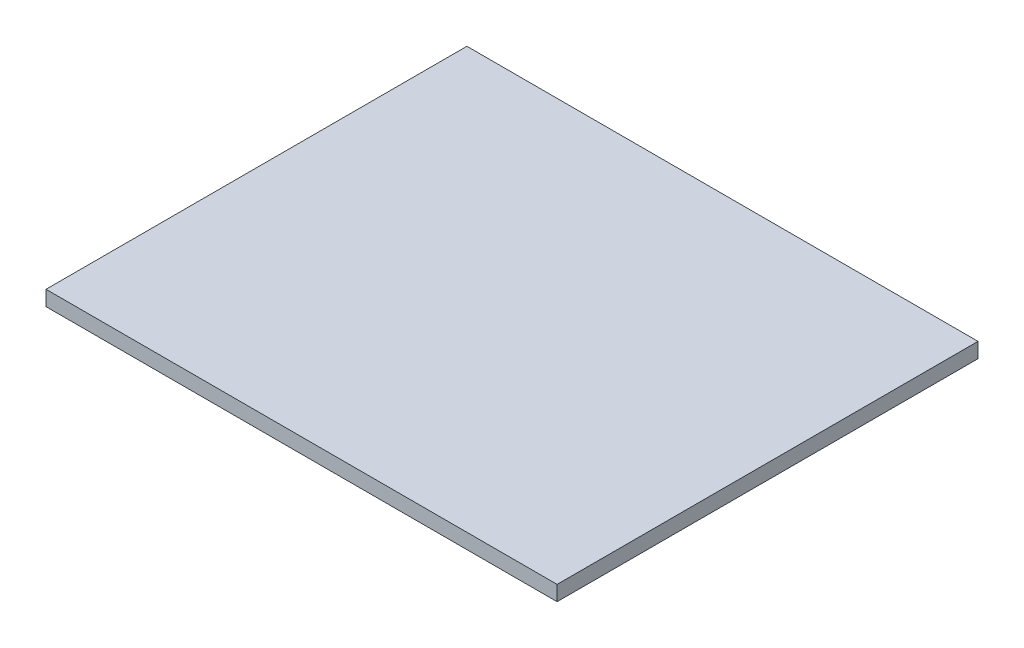
ISO-10303-21;
HEADER;
FILE_DESCRIPTION(('STEP AP214'),'2;1');
FILE_NAME('part.step','',(''),(''),'','','');
FILE_SCHEMA(('AUTOMOTIVE_DESIGN { 1 0 10303 214 1 1 1 1 }'));
ENDSEC;
DATA;
#1=APPLICATION_CONTEXT('core data for automotive mechanical design processes');
#2=APPLICATION_PROTOCOL_DEFINITION('international standard','automotive_design',2000,#1);
#3=PRODUCT_CONTEXT('',#1,'mechanical');
#4=PRODUCT('Part','Part','',(#3));
#5=PRODUCT_RELATED_PRODUCT_CATEGORY('part','',(#4));
#6=PRODUCT_DEFINITION_FORMATION('','',#4);
#7=PRODUCT_DEFINITION_CONTEXT('part definition',#1,'design');
#8=PRODUCT_DEFINITION('design','',#6,#7);
#9=PRODUCT_DEFINITION_SHAPE('','',#8);
#10=(LENGTH_UNIT() NAMED_UNIT(*) SI_UNIT(.MILLI.,.METRE.));
#11=(NAMED_UNIT(*) PLANE_ANGLE_UNIT() SI_UNIT($,.RADIAN.));
#12=(NAMED_UNIT(*) SI_UNIT($,.STERADIAN.) SOLID_ANGLE_UNIT());
#13=UNCERTAINTY_MEASURE_WITH_UNIT(LENGTH_MEASURE(1.E-05),#10,'distance_accuracy_value','');
#14=(GEOMETRIC_REPRESENTATION_CONTEXT(3) GLOBAL_UNCERTAINTY_ASSIGNED_CONTEXT((#13)) GLOBAL_UNIT_ASSIGNED_CONTEXT((#10,
#11,#12)) REPRESENTATION_CONTEXT('',''));
#15=CARTESIAN_POINT('',(0.,0.,0.));
#16=DIRECTION('',(0.,0.,1.));
#17=DIRECTION('',(1.,0.,0.));
#18=AXIS2_PLACEMENT_3D('',#15,#16,#17);
#19=CARTESIAN_POINT('',(0.,5.,0.));
#20=DIRECTION('',(1.,0.,0.));
#21=DIRECTION('',(0.,0.,-1.));
#22=AXIS2_PLACEMENT_3D('',#19,#20,#21);
#23=PLANE('',#22);
#24=DIRECTION('',(0.,0.,1.));
#25=VECTOR('',#24,1.);
#26=CARTESIAN_POINT('',(0.,0.,0.));
#27=LINE('',#26,#25);
#28=CARTESIAN_POINT('',(0.,0.,-140.));
#29=VERTEX_POINT('',#28);
#30=CARTESIAN_POINT('',(0.,0.,0.));
#31=VERTEX_POINT('',#30);
#32=EDGE_CURVE('E98',#29,#31,#27,.T.);
#33=ORIENTED_EDGE('',*,*,#32,.T.);
#34=DIRECTION('',(0.,-1.,0.));
#35=VECTOR('',#34,1.);
#36=CARTESIAN_POINT('',(0.,5.,0.));
#37=LINE('',#36,#35);
#38=CARTESIAN_POINT('',(0.,5.,0.));
#39=VERTEX_POINT('',#38);
#40=EDGE_CURVE('E11',#39,#31,#37,.T.);
#41=ORIENTED_EDGE('',*,*,#40,.F.);
#42=DIRECTION('',(0.,0.,1.));
#43=VECTOR('',#42,1.);
#44=CARTESIAN_POINT('',(0.,5.,0.));
#45=LINE('',#44,#43);
#46=CARTESIAN_POINT('',(0.,5.,-140.));
#47=VERTEX_POINT('',#46);
#48=EDGE_CURVE('E86',#47,#39,#45,.T.);
#49=ORIENTED_EDGE('',*,*,#48,.F.);
#50=DIRECTION('',(0.,-1.,0.));
#51=VECTOR('',#50,1.);
#52=CARTESIAN_POINT('',(0.,5.,-140.));
#53=LINE('',#52,#51);
#54=EDGE_CURVE('E94',#47,#29,#53,.T.);
#55=ORIENTED_EDGE('',*,*,#54,.T.);
#56=EDGE_LOOP('',(#33,#41,#49,#55));
#57=FACE_BOUND('',#56,.T.);
#58=ADVANCED_FACE('F35',(#57),#23,.F.);
#59=CARTESIAN_POINT('',(0.,5.,0.));
#60=DIRECTION('',(0.,0.,-1.));
#61=DIRECTION('',(-1.,0.,0.));
#62=AXIS2_PLACEMENT_3D('',#59,#60,#61);
#63=PLANE('',#62);
#64=DIRECTION('',(1.,0.,0.));
#65=VECTOR('',#64,1.);
#66=CARTESIAN_POINT('',(0.,0.,0.));
#67=LINE('',#66,#65);
#68=CARTESIAN_POINT('',(170.,0.,0.));
#69=VERTEX_POINT('',#68);
#70=EDGE_CURVE('E90',#31,#69,#67,.T.);
#71=ORIENTED_EDGE('',*,*,#70,.T.);
#72=DIRECTION('',(0.,-1.,0.));
#73=VECTOR('',#72,1.);
#74=CARTESIAN_POINT('',(170.,5.,0.));
#75=LINE('',#74,#73);
#76=CARTESIAN_POINT('',(170.,5.,0.));
#77=VERTEX_POINT('',#76);
#78=EDGE_CURVE('E43',#77,#69,#75,.T.);
#79=ORIENTED_EDGE('',*,*,#78,.F.);
#80=DIRECTION('',(1.,0.,0.));
#81=VECTOR('',#80,1.);
#82=CARTESIAN_POINT('',(0.,5.,0.));
#83=LINE('',#82,#81);
#84=EDGE_CURVE('E81',#39,#77,#83,.T.);
#85=ORIENTED_EDGE('',*,*,#84,.F.);
#86=ORIENTED_EDGE('',*,*,#40,.T.);
#87=EDGE_LOOP('',(#71,#79,#85,#86));
#88=FACE_BOUND('',#87,.T.);
#89=ADVANCED_FACE('F89',(#88),#63,.F.);
#90=CARTESIAN_POINT('',(170.,5.,0.));
#91=DIRECTION('',(-1.,0.,0.));
#92=DIRECTION('',(0.,0.,1.));
#93=AXIS2_PLACEMENT_3D('',#90,#91,#92);
#94=PLANE('',#93);
#95=DIRECTION('',(0.,0.,-1.));
#96=VECTOR('',#95,1.);
#97=CARTESIAN_POINT('',(170.,0.,0.));
#98=LINE('',#97,#96);
#99=CARTESIAN_POINT('',(170.,0.,-140.));
#100=VERTEX_POINT('',#99);
#101=EDGE_CURVE('E68',#69,#100,#98,.T.);
#102=ORIENTED_EDGE('',*,*,#101,.T.);
#103=DIRECTION('',(0.,-1.,0.));
#104=VECTOR('',#103,1.);
#105=CARTESIAN_POINT('',(170.,5.,-140.));
#106=LINE('',#105,#104);
#107=CARTESIAN_POINT('',(170.,5.,-140.));
#108=VERTEX_POINT('',#107);
#109=EDGE_CURVE('E91',#108,#100,#106,.T.);
#110=ORIENTED_EDGE('',*,*,#109,.F.);
#111=DIRECTION('',(0.,0.,-1.));
#112=VECTOR('',#111,1.);
#113=CARTESIAN_POINT('',(170.,5.,0.));
#114=LINE('',#113,#112);
#115=EDGE_CURVE('E84',#77,#108,#114,.T.);
#116=ORIENTED_EDGE('',*,*,#115,.F.);
#117=ORIENTED_EDGE('',*,*,#78,.T.);
#118=EDGE_LOOP('',(#102,#110,#116,#117));
#119=FACE_BOUND('',#118,.T.);
#120=ADVANCED_FACE('F92',(#119),#94,.F.);
#121=CARTESIAN_POINT('',(0.,5.,-140.));
#122=DIRECTION('',(0.,0.,1.));
#123=DIRECTION('',(1.,0.,0.));
#124=AXIS2_PLACEMENT_3D('',#121,#122,#123);
#125=PLANE('',#124);
#126=DIRECTION('',(-1.,0.,0.));
#127=VECTOR('',#126,1.);
#128=CARTESIAN_POINT('',(0.,0.,-140.));
#129=LINE('',#128,#127);
#130=EDGE_CURVE('E74',#100,#29,#129,.T.);
#131=ORIENTED_EDGE('',*,*,#130,.T.);
#132=ORIENTED_EDGE('',*,*,#54,.F.);
#133=DIRECTION('',(-1.,0.,0.));
#134=VECTOR('',#133,1.);
#135=CARTESIAN_POINT('',(0.,5.,-140.));
#136=LINE('',#135,#134);
#137=EDGE_CURVE('E51',#108,#47,#136,.T.);
#138=ORIENTED_EDGE('',*,*,#137,.F.);
#139=ORIENTED_EDGE('',*,*,#109,.T.);
#140=EDGE_LOOP('',(#131,#132,#138,#139));
#141=FACE_BOUND('',#140,.T.);
#142=ADVANCED_FACE('F105',(#141),#125,.F.);
#143=CARTESIAN_POINT('',(0.,5.,0.));
#144=DIRECTION('',(0.,-1.,0.));
#145=DIRECTION('',(0.,0.,-1.));
#146=AXIS2_PLACEMENT_3D('',#143,#144,#145);
#147=PLANE('',#146);
#148=ORIENTED_EDGE('',*,*,#48,.T.);
#149=ORIENTED_EDGE('',*,*,#84,.T.);
#150=ORIENTED_EDGE('',*,*,#115,.T.);
#151=ORIENTED_EDGE('',*,*,#137,.T.);
#152=EDGE_LOOP('',(#148,#149,#150,#151));
#153=FACE_BOUND('',#152,.T.);
#154=ADVANCED_FACE('F82',(#153),#147,.F.);
#155=CARTESIAN_POINT('',(0.,0.,0.));
#156=DIRECTION('',(0.,-1.,0.));
#157=DIRECTION('',(0.,0.,-1.));
#158=AXIS2_PLACEMENT_3D('',#155,#156,#157);
#159=PLANE('',#158);
#160=ORIENTED_EDGE('',*,*,#32,.F.);
#161=ORIENTED_EDGE('',*,*,#130,.F.);
#162=ORIENTED_EDGE('',*,*,#101,.F.);
#163=ORIENTED_EDGE('',*,*,#70,.F.);
#164=EDGE_LOOP('',(#160,#161,#162,#163));
#165=FACE_BOUND('',#164,.T.);
#166=ADVANCED_FACE('F108',(#165),#159,.T.);
#167=CLOSED_SHELL('',(#58,#89,#120,#142,#154,#166));
#168=MANIFOLD_SOLID_BREP('B2',#167);
#169=ADVANCED_BREP_SHAPE_REPRESENTATION('',(#18,#168),#14);
#170=SHAPE_DEFINITION_REPRESENTATION(#9,#169);
ENDSEC;
END-ISO-10303-21;
